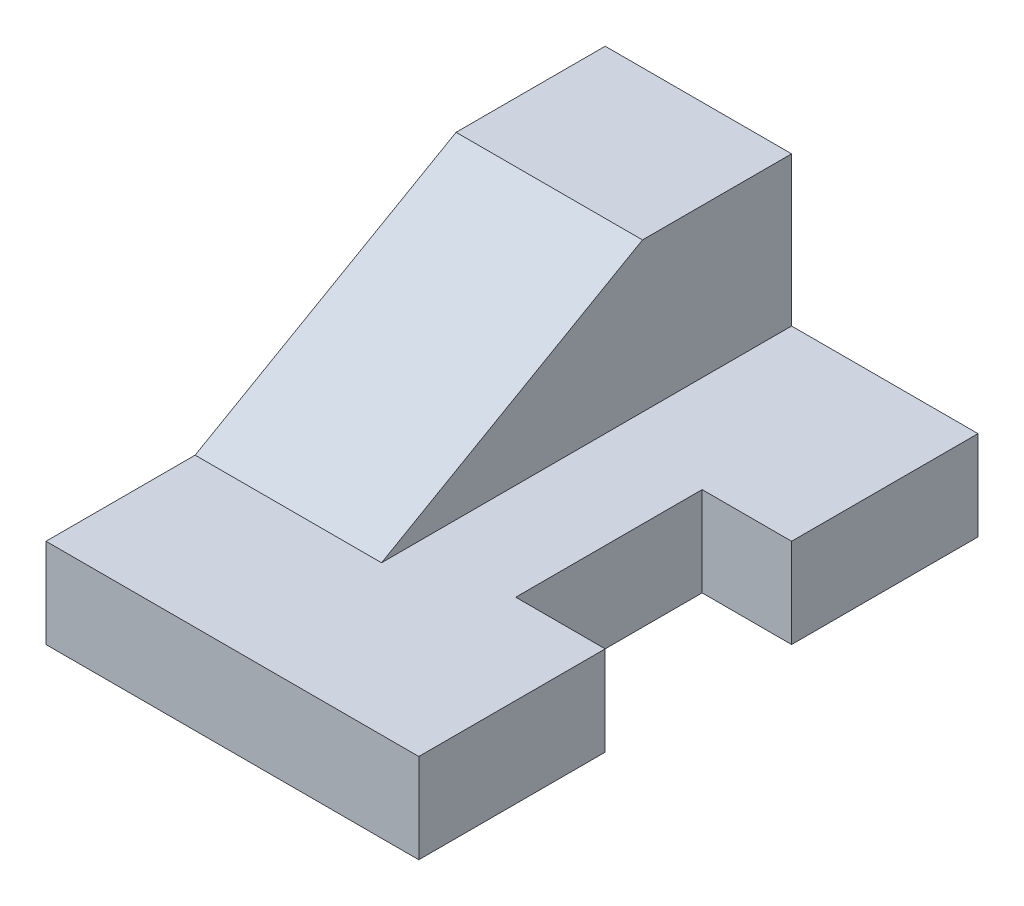
ISO-10303-21;
HEADER;
FILE_DESCRIPTION(('STEP AP214'),'2;1');
FILE_NAME('part.step','',(''),(''),'','','');
FILE_SCHEMA(('AUTOMOTIVE_DESIGN { 1 0 10303 214 1 1 1 1 }'));
ENDSEC;
DATA;
#1=APPLICATION_CONTEXT('core data for automotive mechanical design processes');
#2=APPLICATION_PROTOCOL_DEFINITION('international standard','automotive_design',2000,#1);
#3=PRODUCT_CONTEXT('',#1,'mechanical');
#4=PRODUCT('Part','Part','',(#3));
#5=PRODUCT_RELATED_PRODUCT_CATEGORY('part','',(#4));
#6=PRODUCT_DEFINITION_FORMATION('','',#4);
#7=PRODUCT_DEFINITION_CONTEXT('part definition',#1,'design');
#8=PRODUCT_DEFINITION('design','',#6,#7);
#9=PRODUCT_DEFINITION_SHAPE('','',#8);
#10=(LENGTH_UNIT() NAMED_UNIT(*) SI_UNIT(.MILLI.,.METRE.));
#11=(NAMED_UNIT(*) PLANE_ANGLE_UNIT() SI_UNIT($,.RADIAN.));
#12=(NAMED_UNIT(*) SI_UNIT($,.STERADIAN.) SOLID_ANGLE_UNIT());
#13=UNCERTAINTY_MEASURE_WITH_UNIT(LENGTH_MEASURE(1.E-05),#10,'distance_accuracy_value','');
#14=(GEOMETRIC_REPRESENTATION_CONTEXT(3) GLOBAL_UNCERTAINTY_ASSIGNED_CONTEXT((#13)) GLOBAL_UNIT_ASSIGNED_CONTEXT((#10,
#11,#12)) REPRESENTATION_CONTEXT('',''));
#15=CARTESIAN_POINT('',(0.,0.,0.));
#16=DIRECTION('',(0.,0.,1.));
#17=DIRECTION('',(1.,0.,0.));
#18=AXIS2_PLACEMENT_3D('',#15,#16,#17);
#19=CARTESIAN_POINT('',(50.,12.,0.));
#20=DIRECTION('',(0.,0.,-1.));
#21=DIRECTION('',(-1.,0.,0.));
#22=AXIS2_PLACEMENT_3D('',#19,#20,#21);
#23=PLANE('',#22);
#24=DIRECTION('',(1.,0.,0.));
#25=VECTOR('',#24,1.);
#26=CARTESIAN_POINT('',(50.,0.,0.));
#27=LINE('',#26,#25);
#28=CARTESIAN_POINT('',(0.,0.,0.));
#29=VERTEX_POINT('',#28);
#30=CARTESIAN_POINT('',(50.,0.,0.));
#31=VERTEX_POINT('',#30);
#32=EDGE_CURVE('E155',#29,#31,#27,.T.);
#33=ORIENTED_EDGE('',*,*,#32,.T.);
#34=DIRECTION('',(0.,-1.,0.));
#35=VECTOR('',#34,1.);
#36=CARTESIAN_POINT('',(50.,12.,0.));
#37=LINE('',#36,#35);
#38=CARTESIAN_POINT('',(50.,12.,0.));
#39=VERTEX_POINT('',#38);
#40=EDGE_CURVE('E11',#39,#31,#37,.T.);
#41=ORIENTED_EDGE('',*,*,#40,.F.);
#42=DIRECTION('',(1.,0.,0.));
#43=VECTOR('',#42,1.);
#44=CARTESIAN_POINT('',(50.,12.,0.));
#45=LINE('',#44,#43);
#46=CARTESIAN_POINT('',(0.,12.,0.));
#47=VERTEX_POINT('',#46);
#48=EDGE_CURVE('E179',#47,#39,#45,.T.);
#49=ORIENTED_EDGE('',*,*,#48,.F.);
#50=DIRECTION('',(0.,-1.,0.));
#51=VECTOR('',#50,1.);
#52=CARTESIAN_POINT('',(0.,12.,0.));
#53=LINE('',#52,#51);
#54=EDGE_CURVE('E154',#47,#29,#53,.T.);
#55=ORIENTED_EDGE('',*,*,#54,.T.);
#56=EDGE_LOOP('',(#33,#41,#49,#55));
#57=FACE_BOUND('',#56,.T.);
#58=ADVANCED_FACE('F39',(#57),#23,.F.);
#59=CARTESIAN_POINT('',(50.,12.,-25.));
#60=DIRECTION('',(-1.,0.,0.));
#61=DIRECTION('',(0.,0.,1.));
#62=AXIS2_PLACEMENT_3D('',#59,#60,#61);
#63=PLANE('',#62);
#64=DIRECTION('',(0.,0.,-1.));
#65=VECTOR('',#64,1.);
#66=CARTESIAN_POINT('',(50.,0.,-25.));
#67=LINE('',#66,#65);
#68=CARTESIAN_POINT('',(50.,0.,-25.));
#69=VERTEX_POINT('',#68);
#70=EDGE_CURVE('E159',#31,#69,#67,.T.);
#71=ORIENTED_EDGE('',*,*,#70,.T.);
#72=DIRECTION('',(0.,-1.,0.));
#73=VECTOR('',#72,1.);
#74=CARTESIAN_POINT('',(50.,12.,-25.));
#75=LINE('',#74,#73);
#76=CARTESIAN_POINT('',(50.,12.,-25.));
#77=VERTEX_POINT('',#76);
#78=EDGE_CURVE('E47',#77,#69,#75,.T.);
#79=ORIENTED_EDGE('',*,*,#78,.F.);
#80=DIRECTION('',(0.,0.,-1.));
#81=VECTOR('',#80,1.);
#82=CARTESIAN_POINT('',(50.,12.,-25.));
#83=LINE('',#82,#81);
#84=EDGE_CURVE('E104',#39,#77,#83,.T.);
#85=ORIENTED_EDGE('',*,*,#84,.F.);
#86=ORIENTED_EDGE('',*,*,#40,.T.);
#87=EDGE_LOOP('',(#71,#79,#85,#86));
#88=FACE_BOUND('',#87,.T.);
#89=ADVANCED_FACE('F272',(#88),#63,.F.);
#90=CARTESIAN_POINT('',(38.,12.,-25.));
#91=DIRECTION('',(0.,0.,1.));
#92=DIRECTION('',(1.,0.,0.));
#93=AXIS2_PLACEMENT_3D('',#90,#91,#92);
#94=PLANE('',#93);
#95=DIRECTION('',(-1.,0.,0.));
#96=VECTOR('',#95,1.);
#97=CARTESIAN_POINT('',(38.,0.,-25.));
#98=LINE('',#97,#96);
#99=CARTESIAN_POINT('',(38.,0.,-25.));
#100=VERTEX_POINT('',#99);
#101=EDGE_CURVE('E163',#69,#100,#98,.T.);
#102=ORIENTED_EDGE('',*,*,#101,.T.);
#103=DIRECTION('',(0.,-1.,0.));
#104=VECTOR('',#103,1.);
#105=CARTESIAN_POINT('',(38.,12.,-25.));
#106=LINE('',#105,#104);
#107=CARTESIAN_POINT('',(38.,12.,-25.));
#108=VERTEX_POINT('',#107);
#109=EDGE_CURVE('E189',#108,#100,#106,.T.);
#110=ORIENTED_EDGE('',*,*,#109,.F.);
#111=DIRECTION('',(-1.,0.,0.));
#112=VECTOR('',#111,1.);
#113=CARTESIAN_POINT('',(38.,12.,-25.));
#114=LINE('',#113,#112);
#115=EDGE_CURVE('E199',#77,#108,#114,.T.);
#116=ORIENTED_EDGE('',*,*,#115,.F.);
#117=ORIENTED_EDGE('',*,*,#78,.T.);
#118=EDGE_LOOP('',(#102,#110,#116,#117));
#119=FACE_BOUND('',#118,.T.);
#120=ADVANCED_FACE('F197',(#119),#94,.F.);
#121=CARTESIAN_POINT('',(38.,12.,-50.));
#122=DIRECTION('',(-1.,0.,0.));
#123=DIRECTION('',(0.,0.,1.));
#124=AXIS2_PLACEMENT_3D('',#121,#122,#123);
#125=PLANE('',#124);
#126=DIRECTION('',(0.,0.,-1.));
#127=VECTOR('',#126,1.);
#128=CARTESIAN_POINT('',(38.,0.,-50.));
#129=LINE('',#128,#127);
#130=CARTESIAN_POINT('',(38.,0.,-50.));
#131=VERTEX_POINT('',#130);
#132=EDGE_CURVE('E166',#100,#131,#129,.T.);
#133=ORIENTED_EDGE('',*,*,#132,.T.);
#134=DIRECTION('',(0.,-1.,0.));
#135=VECTOR('',#134,1.);
#136=CARTESIAN_POINT('',(38.,12.,-50.));
#137=LINE('',#136,#135);
#138=CARTESIAN_POINT('',(38.,12.,-50.));
#139=VERTEX_POINT('',#138);
#140=EDGE_CURVE('E139',#139,#131,#137,.T.);
#141=ORIENTED_EDGE('',*,*,#140,.F.);
#142=DIRECTION('',(0.,0.,-1.));
#143=VECTOR('',#142,1.);
#144=CARTESIAN_POINT('',(38.,12.,-50.));
#145=LINE('',#144,#143);
#146=EDGE_CURVE('E125',#108,#139,#145,.T.);
#147=ORIENTED_EDGE('',*,*,#146,.F.);
#148=ORIENTED_EDGE('',*,*,#109,.T.);
#149=EDGE_LOOP('',(#133,#141,#147,#148));
#150=FACE_BOUND('',#149,.T.);
#151=ADVANCED_FACE('F205',(#150),#125,.F.);
#152=CARTESIAN_POINT('',(50.,12.,-50.));
#153=DIRECTION('',(0.,0.,-1.));
#154=DIRECTION('',(-1.,0.,0.));
#155=AXIS2_PLACEMENT_3D('',#152,#153,#154);
#156=PLANE('',#155);
#157=DIRECTION('',(1.,0.,0.));
#158=VECTOR('',#157,1.);
#159=CARTESIAN_POINT('',(50.,0.,-50.));
#160=LINE('',#159,#158);
#161=CARTESIAN_POINT('',(50.,0.,-50.));
#162=VERTEX_POINT('',#161);
#163=EDGE_CURVE('E135',#131,#162,#160,.T.);
#164=ORIENTED_EDGE('',*,*,#163,.T.);
#165=DIRECTION('',(0.,-1.,0.));
#166=VECTOR('',#165,1.);
#167=CARTESIAN_POINT('',(50.,12.,-50.));
#168=LINE('',#167,#166);
#169=CARTESIAN_POINT('',(50.,12.,-50.));
#170=VERTEX_POINT('',#169);
#171=EDGE_CURVE('E132',#170,#162,#168,.T.);
#172=ORIENTED_EDGE('',*,*,#171,.F.);
#173=DIRECTION('',(1.,0.,0.));
#174=VECTOR('',#173,1.);
#175=CARTESIAN_POINT('',(50.,12.,-50.));
#176=LINE('',#175,#174);
#177=EDGE_CURVE('E117',#139,#170,#176,.T.);
#178=ORIENTED_EDGE('',*,*,#177,.F.);
#179=ORIENTED_EDGE('',*,*,#140,.T.);
#180=EDGE_LOOP('',(#164,#172,#178,#179));
#181=FACE_BOUND('',#180,.T.);
#182=ADVANCED_FACE('F133',(#181),#156,.F.);
#183=CARTESIAN_POINT('',(50.,12.,-75.));
#184=DIRECTION('',(-1.,0.,0.));
#185=DIRECTION('',(0.,0.,1.));
#186=AXIS2_PLACEMENT_3D('',#183,#184,#185);
#187=PLANE('',#186);
#188=DIRECTION('',(0.,0.,-1.));
#189=VECTOR('',#188,1.);
#190=CARTESIAN_POINT('',(50.,0.,-75.));
#191=LINE('',#190,#189);
#192=CARTESIAN_POINT('',(50.,0.,-75.));
#193=VERTEX_POINT('',#192);
#194=EDGE_CURVE('E171',#162,#193,#191,.T.);
#195=ORIENTED_EDGE('',*,*,#194,.T.);
#196=DIRECTION('',(0.,-1.,0.));
#197=VECTOR('',#196,1.);
#198=CARTESIAN_POINT('',(50.,12.,-75.));
#199=LINE('',#198,#197);
#200=CARTESIAN_POINT('',(50.,12.,-75.));
#201=VERTEX_POINT('',#200);
#202=EDGE_CURVE('E140',#201,#193,#199,.T.);
#203=ORIENTED_EDGE('',*,*,#202,.F.);
#204=DIRECTION('',(0.,0.,-1.));
#205=VECTOR('',#204,1.);
#206=CARTESIAN_POINT('',(50.,12.,-75.));
#207=LINE('',#206,#205);
#208=EDGE_CURVE('E122',#170,#201,#207,.T.);
#209=ORIENTED_EDGE('',*,*,#208,.F.);
#210=ORIENTED_EDGE('',*,*,#171,.T.);
#211=EDGE_LOOP('',(#195,#203,#209,#210));
#212=FACE_BOUND('',#211,.T.);
#213=ADVANCED_FACE('F142',(#212),#187,.F.);
#214=CARTESIAN_POINT('',(0.,12.,-75.));
#215=DIRECTION('',(0.,0.,1.));
#216=DIRECTION('',(1.,0.,0.));
#217=AXIS2_PLACEMENT_3D('',#214,#215,#216);
#218=PLANE('',#217);
#219=DIRECTION('',(-1.,0.,0.));
#220=VECTOR('',#219,1.);
#221=CARTESIAN_POINT('',(0.,0.,-75.));
#222=LINE('',#221,#220);
#223=CARTESIAN_POINT('',(0.,0.,-75.));
#224=VERTEX_POINT('',#223);
#225=EDGE_CURVE('E174',#193,#224,#222,.T.);
#226=ORIENTED_EDGE('',*,*,#225,.T.);
#227=DIRECTION('',(0.,-1.,0.));
#228=VECTOR('',#227,1.);
#229=CARTESIAN_POINT('',(0.,12.,-75.));
#230=LINE('',#229,#228);
#231=CARTESIAN_POINT('',(0.,32.,-75.));
#232=VERTEX_POINT('',#231);
#233=EDGE_CURVE('E182',#232,#224,#230,.T.);
#234=ORIENTED_EDGE('',*,*,#233,.F.);
#235=DIRECTION('',(-1.,0.,0.));
#236=VECTOR('',#235,1.);
#237=CARTESIAN_POINT('',(25.,32.,-75.));
#238=LINE('',#237,#236);
#239=CARTESIAN_POINT('',(25.,32.,-75.));
#240=VERTEX_POINT('',#239);
#241=EDGE_CURVE('E160',#240,#232,#238,.T.);
#242=ORIENTED_EDGE('',*,*,#241,.F.);
#243=DIRECTION('',(0.,-1.,0.));
#244=VECTOR('',#243,1.);
#245=CARTESIAN_POINT('',(25.,12.,-75.));
#246=LINE('',#245,#244);
#247=CARTESIAN_POINT('',(25.,12.,-75.));
#248=VERTEX_POINT('',#247);
#249=EDGE_CURVE('E228',#240,#248,#246,.T.);
#250=ORIENTED_EDGE('',*,*,#249,.T.);
#251=DIRECTION('',(-1.,0.,0.));
#252=VECTOR('',#251,1.);
#253=CARTESIAN_POINT('',(0.,12.,-75.));
#254=LINE('',#253,#252);
#255=EDGE_CURVE('E146',#201,#248,#254,.T.);
#256=ORIENTED_EDGE('',*,*,#255,.F.);
#257=ORIENTED_EDGE('',*,*,#202,.T.);
#258=EDGE_LOOP('',(#226,#234,#242,#250,#256,#257));
#259=FACE_BOUND('',#258,.T.);
#260=ADVANCED_FACE('F248',(#259),#218,.F.);
#261=CARTESIAN_POINT('',(0.,12.,0.));
#262=DIRECTION('',(1.,0.,0.));
#263=DIRECTION('',(0.,0.,-1.));
#264=AXIS2_PLACEMENT_3D('',#261,#262,#263);
#265=PLANE('',#264);
#266=DIRECTION('',(0.,0.,1.));
#267=VECTOR('',#266,1.);
#268=CARTESIAN_POINT('',(0.,0.,0.));
#269=LINE('',#268,#267);
#270=EDGE_CURVE('E96',#224,#29,#269,.T.);
#271=ORIENTED_EDGE('',*,*,#270,.T.);
#272=ORIENTED_EDGE('',*,*,#54,.F.);
#273=DIRECTION('',(0.,0.,1.));
#274=VECTOR('',#273,1.);
#275=CARTESIAN_POINT('',(0.,12.,0.));
#276=LINE('',#275,#274);
#277=CARTESIAN_POINT('',(0.,12.,-20.));
#278=VERTEX_POINT('',#277);
#279=EDGE_CURVE('E62',#278,#47,#276,.T.);
#280=ORIENTED_EDGE('',*,*,#279,.F.);
#281=DIRECTION('',(0.,0.496138938356834,-0.868243142124459));
#282=VECTOR('',#281,1.);
#283=CARTESIAN_POINT('',(0.,32.,-55.));
#284=LINE('',#283,#282);
#285=CARTESIAN_POINT('',(0.,32.,-55.));
#286=VERTEX_POINT('',#285);
#287=EDGE_CURVE('E54',#278,#286,#284,.T.);
#288=ORIENTED_EDGE('',*,*,#287,.T.);
#289=DIRECTION('',(0.,0.,-1.));
#290=VECTOR('',#289,1.);
#291=CARTESIAN_POINT('',(0.,32.,-75.));
#292=LINE('',#291,#290);
#293=EDGE_CURVE('E224',#286,#232,#292,.T.);
#294=ORIENTED_EDGE('',*,*,#293,.T.);
#295=ORIENTED_EDGE('',*,*,#233,.T.);
#296=EDGE_LOOP('',(#271,#272,#280,#288,#294,#295));
#297=FACE_BOUND('',#296,.T.);
#298=ADVANCED_FACE('F268',(#297),#265,.F.);
#299=CARTESIAN_POINT('',(0.,12.,0.));
#300=DIRECTION('',(0.,-1.,0.));
#301=DIRECTION('',(0.,0.,-1.));
#302=AXIS2_PLACEMENT_3D('',#299,#300,#301);
#303=PLANE('',#302);
#304=ORIENTED_EDGE('',*,*,#255,.T.);
#305=DIRECTION('',(0.,0.,1.));
#306=VECTOR('',#305,1.);
#307=CARTESIAN_POINT('',(25.,12.,-75.));
#308=LINE('',#307,#306);
#309=CARTESIAN_POINT('',(25.,12.,-20.));
#310=VERTEX_POINT('',#309);
#311=EDGE_CURVE('E238',#248,#310,#308,.T.);
#312=ORIENTED_EDGE('',*,*,#311,.T.);
#313=DIRECTION('',(-1.,0.,0.));
#314=VECTOR('',#313,1.);
#315=CARTESIAN_POINT('',(25.,12.,-20.));
#316=LINE('',#315,#314);
#317=EDGE_CURVE('E214',#310,#278,#316,.T.);
#318=ORIENTED_EDGE('',*,*,#317,.T.);
#319=ORIENTED_EDGE('',*,*,#279,.T.);
#320=ORIENTED_EDGE('',*,*,#48,.T.);
#321=ORIENTED_EDGE('',*,*,#84,.T.);
#322=ORIENTED_EDGE('',*,*,#115,.T.);
#323=ORIENTED_EDGE('',*,*,#146,.T.);
#324=ORIENTED_EDGE('',*,*,#177,.T.);
#325=ORIENTED_EDGE('',*,*,#208,.T.);
#326=EDGE_LOOP('',(#304,#312,#318,#319,#320,#321,#322,#323,#324,#325));
#327=FACE_BOUND('',#326,.T.);
#328=ADVANCED_FACE('F120',(#327),#303,.F.);
#329=CARTESIAN_POINT('',(0.,0.,0.));
#330=DIRECTION('',(0.,-1.,0.));
#331=DIRECTION('',(0.,0.,-1.));
#332=AXIS2_PLACEMENT_3D('',#329,#330,#331);
#333=PLANE('',#332);
#334=ORIENTED_EDGE('',*,*,#32,.F.);
#335=ORIENTED_EDGE('',*,*,#270,.F.);
#336=ORIENTED_EDGE('',*,*,#225,.F.);
#337=ORIENTED_EDGE('',*,*,#194,.F.);
#338=ORIENTED_EDGE('',*,*,#163,.F.);
#339=ORIENTED_EDGE('',*,*,#132,.F.);
#340=ORIENTED_EDGE('',*,*,#101,.F.);
#341=ORIENTED_EDGE('',*,*,#70,.F.);
#342=EDGE_LOOP('',(#334,#335,#336,#337,#338,#339,#340,#341));
#343=FACE_BOUND('',#342,.T.);
#344=ADVANCED_FACE('F203',(#343),#333,.T.);
#345=CARTESIAN_POINT('',(25.,32.,-75.));
#346=DIRECTION('',(0.,1.,0.));
#347=DIRECTION('',(0.,0.,1.));
#348=AXIS2_PLACEMENT_3D('',#345,#346,#347);
#349=PLANE('',#348);
#350=ORIENTED_EDGE('',*,*,#293,.F.);
#351=DIRECTION('',(-1.,0.,0.));
#352=VECTOR('',#351,1.);
#353=CARTESIAN_POINT('',(25.,32.,-55.));
#354=LINE('',#353,#352);
#355=CARTESIAN_POINT('',(25.,32.,-55.));
#356=VERTEX_POINT('',#355);
#357=EDGE_CURVE('E217',#356,#286,#354,.T.);
#358=ORIENTED_EDGE('',*,*,#357,.F.);
#359=DIRECTION('',(0.,0.,-1.));
#360=VECTOR('',#359,1.);
#361=CARTESIAN_POINT('',(25.,32.,-75.));
#362=LINE('',#361,#360);
#363=EDGE_CURVE('E218',#356,#240,#362,.T.);
#364=ORIENTED_EDGE('',*,*,#363,.T.);
#365=ORIENTED_EDGE('',*,*,#241,.T.);
#366=EDGE_LOOP('',(#350,#358,#364,#365));
#367=FACE_BOUND('',#366,.T.);
#368=ADVANCED_FACE('F267',(#367),#349,.T.);
#369=CARTESIAN_POINT('',(25.,32.,-55.));
#370=DIRECTION('',(0.,0.868243142124459,0.496138938356834));
#371=DIRECTION('',(0.,-0.496138938356834,0.868243142124459));
#372=AXIS2_PLACEMENT_3D('',#369,#370,#371);
#373=PLANE('',#372);
#374=ORIENTED_EDGE('',*,*,#287,.F.);
#375=ORIENTED_EDGE('',*,*,#317,.F.);
#376=DIRECTION('',(0.,0.496138938356834,-0.868243142124459));
#377=VECTOR('',#376,1.);
#378=CARTESIAN_POINT('',(25.,32.,-55.));
#379=LINE('',#378,#377);
#380=EDGE_CURVE('E234',#310,#356,#379,.T.);
#381=ORIENTED_EDGE('',*,*,#380,.T.);
#382=ORIENTED_EDGE('',*,*,#357,.T.);
#383=EDGE_LOOP('',(#374,#375,#381,#382));
#384=FACE_BOUND('',#383,.T.);
#385=ADVANCED_FACE('F259',(#384),#373,.T.);
#386=CARTESIAN_POINT('',(25.,0.,0.));
#387=DIRECTION('',(1.,0.,0.));
#388=DIRECTION('',(0.,0.,-1.));
#389=AXIS2_PLACEMENT_3D('',#386,#387,#388);
#390=PLANE('',#389);
#391=ORIENTED_EDGE('',*,*,#249,.F.);
#392=ORIENTED_EDGE('',*,*,#363,.F.);
#393=ORIENTED_EDGE('',*,*,#380,.F.);
#394=ORIENTED_EDGE('',*,*,#311,.F.);
#395=EDGE_LOOP('',(#391,#392,#393,#394));
#396=FACE_BOUND('',#395,.T.);
#397=ADVANCED_FACE('F258',(#396),#390,.T.);
#398=CLOSED_SHELL('',(#58,#89,#120,#151,#182,#213,#260,#298,#328,#344,#368,#385,#397));
#399=MANIFOLD_SOLID_BREP('B2',#398);
#400=ADVANCED_BREP_SHAPE_REPRESENTATION('',(#18,#399),#14);
#401=SHAPE_DEFINITION_REPRESENTATION(#9,#400);
ENDSEC;
END-ISO-10303-21;
